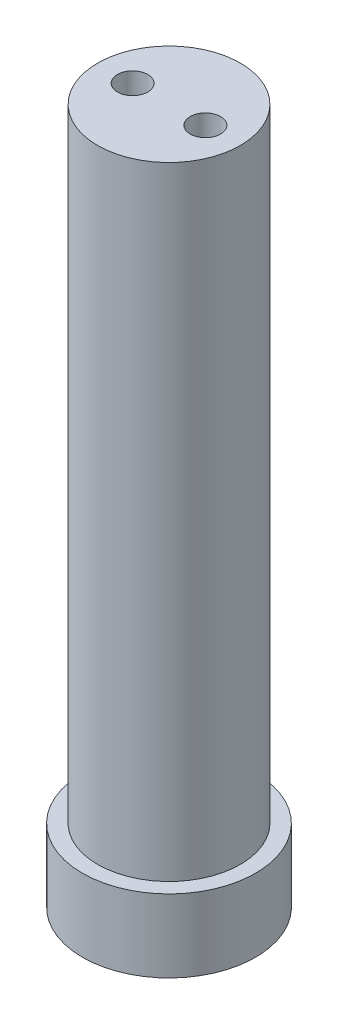
ISO-10303-21;
HEADER;
FILE_DESCRIPTION(('STEP AP214'),'2;1');
FILE_NAME('part.step','',(''),(''),'','','');
FILE_SCHEMA(('AUTOMOTIVE_DESIGN { 1 0 10303 214 1 1 1 1 }'));
ENDSEC;
DATA;
#1=APPLICATION_CONTEXT('core data for automotive mechanical design processes');
#2=APPLICATION_PROTOCOL_DEFINITION('international standard','automotive_design',2000,#1);
#3=PRODUCT_CONTEXT('',#1,'mechanical');
#4=PRODUCT('Part','Part','',(#3));
#5=PRODUCT_RELATED_PRODUCT_CATEGORY('part','',(#4));
#6=PRODUCT_DEFINITION_FORMATION('','',#4);
#7=PRODUCT_DEFINITION_CONTEXT('part definition',#1,'design');
#8=PRODUCT_DEFINITION('design','',#6,#7);
#9=PRODUCT_DEFINITION_SHAPE('','',#8);
#10=(LENGTH_UNIT() NAMED_UNIT(*) SI_UNIT(.MILLI.,.METRE.));
#11=(NAMED_UNIT(*) PLANE_ANGLE_UNIT() SI_UNIT($,.RADIAN.));
#12=(NAMED_UNIT(*) SI_UNIT($,.STERADIAN.) SOLID_ANGLE_UNIT());
#13=UNCERTAINTY_MEASURE_WITH_UNIT(LENGTH_MEASURE(1.E-05),#10,'distance_accuracy_value','');
#14=(GEOMETRIC_REPRESENTATION_CONTEXT(3) GLOBAL_UNCERTAINTY_ASSIGNED_CONTEXT((#13)) GLOBAL_UNIT_ASSIGNED_CONTEXT((#10,
#11,#12)) REPRESENTATION_CONTEXT('',''));
#15=CARTESIAN_POINT('',(0.,0.,0.));
#16=DIRECTION('',(0.,0.,1.));
#17=DIRECTION('',(1.,0.,0.));
#18=AXIS2_PLACEMENT_3D('',#15,#16,#17);
#19=CARTESIAN_POINT('',(0.,0.,0.));
#20=DIRECTION('',(0.,1.,0.));
#21=DIRECTION('',(0.,0.,1.));
#22=AXIS2_PLACEMENT_3D('',#19,#20,#21);
#23=PLANE('',#22);
#24=CARTESIAN_POINT('',(0.,0.,0.));
#25=DIRECTION('',(0.,1.,0.));
#26=DIRECTION('',(0.,0.,1.));
#27=AXIS2_PLACEMENT_3D('',#24,#25,#26);
#28=CIRCLE('',#27,1.51);
#29=CARTESIAN_POINT('',(0.,0.,1.51));
#30=VERTEX_POINT('',#29);
#31=EDGE_CURVE('E18',#30,#30,#28,.T.);
#32=ORIENTED_EDGE('',*,*,#31,.F.);
#33=EDGE_LOOP('',(#32));
#34=FACE_BOUND('',#33,.T.);
#35=CARTESIAN_POINT('',(0.635,0.,0.));
#36=DIRECTION('',(0.,1.,0.));
#37=DIRECTION('',(0.,0.,1.));
#38=AXIS2_PLACEMENT_3D('',#35,#36,#37);
#39=CIRCLE('',#38,0.265);
#40=CARTESIAN_POINT('',(0.635,0.,0.265));
#41=VERTEX_POINT('',#40);
#42=EDGE_CURVE('E38',#41,#41,#39,.T.);
#43=ORIENTED_EDGE('',*,*,#42,.T.);
#44=EDGE_LOOP('',(#43));
#45=FACE_BOUND('',#44,.T.);
#46=CARTESIAN_POINT('',(-0.635,0.,0.));
#47=DIRECTION('',(0.,1.,0.));
#48=DIRECTION('',(0.,0.,1.));
#49=AXIS2_PLACEMENT_3D('',#46,#47,#48);
#50=CIRCLE('',#49,0.265);
#51=CARTESIAN_POINT('',(-0.635,0.,0.265));
#52=VERTEX_POINT('',#51);
#53=EDGE_CURVE('E40',#52,#52,#50,.T.);
#54=ORIENTED_EDGE('',*,*,#53,.T.);
#55=EDGE_LOOP('',(#54));
#56=FACE_BOUND('',#55,.T.);
#57=ADVANCED_FACE('F15',(#34,#45,#56),#23,.F.);
#58=CARTESIAN_POINT('',(0.,3.69040339472804,0.));
#59=DIRECTION('',(0.,1.,0.));
#60=DIRECTION('',(0.,0.,1.));
#61=AXIS2_PLACEMENT_3D('',#58,#59,#60);
#62=CYLINDRICAL_SURFACE('',#61,1.51);
#63=CARTESIAN_POINT('',(0.,1.27,0.));
#64=DIRECTION('',(0.,1.,0.));
#65=DIRECTION('',(0.,0.,1.));
#66=AXIS2_PLACEMENT_3D('',#63,#64,#65);
#67=CIRCLE('',#66,1.51);
#68=CARTESIAN_POINT('',(0.,1.27,1.51));
#69=VERTEX_POINT('',#68);
#70=EDGE_CURVE('E35',#69,#69,#67,.F.);
#71=ORIENTED_EDGE('',*,*,#70,.T.);
#72=EDGE_LOOP('',(#71));
#73=FACE_BOUND('',#72,.T.);
#74=ORIENTED_EDGE('',*,*,#31,.T.);
#75=EDGE_LOOP('',(#74));
#76=FACE_BOUND('',#75,.T.);
#77=ADVANCED_FACE('F47',(#73,#76),#62,.T.);
#78=CARTESIAN_POINT('',(-0.635,0.,0.));
#79=DIRECTION('',(0.,1.,0.));
#80=DIRECTION('',(0.,0.,1.));
#81=AXIS2_PLACEMENT_3D('',#78,#79,#80);
#82=CYLINDRICAL_SURFACE('',#81,0.265);
#83=ORIENTED_EDGE('',*,*,#53,.F.);
#84=EDGE_LOOP('',(#83));
#85=FACE_BOUND('',#84,.T.);
#86=CARTESIAN_POINT('',(-0.635,12.13,0.));
#87=DIRECTION('',(0.,1.,0.));
#88=DIRECTION('',(0.,0.,1.));
#89=AXIS2_PLACEMENT_3D('',#86,#87,#88);
#90=CIRCLE('',#89,0.265);
#91=CARTESIAN_POINT('',(-0.635,12.13,0.265));
#92=VERTEX_POINT('',#91);
#93=EDGE_CURVE('E32',#92,#92,#90,.T.);
#94=ORIENTED_EDGE('',*,*,#93,.T.);
#95=EDGE_LOOP('',(#94));
#96=FACE_BOUND('',#95,.T.);
#97=ADVANCED_FACE('F57',(#85,#96),#82,.F.);
#98=CARTESIAN_POINT('',(0.635,0.,0.));
#99=DIRECTION('',(0.,1.,0.));
#100=DIRECTION('',(0.,0.,1.));
#101=AXIS2_PLACEMENT_3D('',#98,#99,#100);
#102=CYLINDRICAL_SURFACE('',#101,0.265);
#103=ORIENTED_EDGE('',*,*,#42,.F.);
#104=EDGE_LOOP('',(#103));
#105=FACE_BOUND('',#104,.T.);
#106=CARTESIAN_POINT('',(0.635,12.13,0.));
#107=DIRECTION('',(0.,1.,0.));
#108=DIRECTION('',(0.,0.,1.));
#109=AXIS2_PLACEMENT_3D('',#106,#107,#108);
#110=CIRCLE('',#109,0.265);
#111=CARTESIAN_POINT('',(0.635,12.13,0.265));
#112=VERTEX_POINT('',#111);
#113=EDGE_CURVE('E27',#112,#112,#110,.T.);
#114=ORIENTED_EDGE('',*,*,#113,.T.);
#115=EDGE_LOOP('',(#114));
#116=FACE_BOUND('',#115,.T.);
#117=ADVANCED_FACE('F53',(#105,#116),#102,.F.);
#118=CARTESIAN_POINT('',(1.51,1.27,0.));
#119=DIRECTION('',(0.,-1.,0.));
#120=DIRECTION('',(0.,0.,-1.));
#121=AXIS2_PLACEMENT_3D('',#118,#119,#120);
#122=PLANE('',#121);
#123=ORIENTED_EDGE('',*,*,#70,.F.);
#124=EDGE_LOOP('',(#123));
#125=FACE_BOUND('',#124,.T.);
#126=CARTESIAN_POINT('',(0.,1.27,0.));
#127=DIRECTION('',(0.,1.,0.));
#128=DIRECTION('',(0.,0.,1.));
#129=AXIS2_PLACEMENT_3D('',#126,#127,#128);
#130=CIRCLE('',#129,1.245);
#131=CARTESIAN_POINT('',(0.,1.27,1.245));
#132=VERTEX_POINT('',#131);
#133=EDGE_CURVE('E22',#132,#132,#130,.T.);
#134=ORIENTED_EDGE('',*,*,#133,.F.);
#135=EDGE_LOOP('',(#134));
#136=FACE_BOUND('',#135,.T.);
#137=ADVANCED_FACE('F56',(#125,#136),#122,.F.);
#138=CARTESIAN_POINT('',(1.245,12.13,0.));
#139=DIRECTION('',(0.,-1.,0.));
#140=DIRECTION('',(0.,0.,-1.));
#141=AXIS2_PLACEMENT_3D('',#138,#139,#140);
#142=PLANE('',#141);
#143=CARTESIAN_POINT('',(0.,12.13,0.));
#144=DIRECTION('',(0.,1.,0.));
#145=DIRECTION('',(0.,0.,1.));
#146=AXIS2_PLACEMENT_3D('',#143,#144,#145);
#147=CIRCLE('',#146,1.245);
#148=CARTESIAN_POINT('',(0.,12.13,1.245));
#149=VERTEX_POINT('',#148);
#150=EDGE_CURVE('E10',#149,#149,#147,.F.);
#151=ORIENTED_EDGE('',*,*,#150,.F.);
#152=EDGE_LOOP('',(#151));
#153=FACE_BOUND('',#152,.T.);
#154=ORIENTED_EDGE('',*,*,#113,.F.);
#155=EDGE_LOOP('',(#154));
#156=FACE_BOUND('',#155,.T.);
#157=ORIENTED_EDGE('',*,*,#93,.F.);
#158=EDGE_LOOP('',(#157));
#159=FACE_BOUND('',#158,.T.);
#160=ADVANCED_FACE('F61',(#153,#156,#159),#142,.F.);
#161=CARTESIAN_POINT('',(0.,3.69040339472804,0.));
#162=DIRECTION('',(0.,1.,0.));
#163=DIRECTION('',(0.,0.,1.));
#164=AXIS2_PLACEMENT_3D('',#161,#162,#163);
#165=CYLINDRICAL_SURFACE('',#164,1.245);
#166=ORIENTED_EDGE('',*,*,#150,.T.);
#167=EDGE_LOOP('',(#166));
#168=FACE_BOUND('',#167,.T.);
#169=ORIENTED_EDGE('',*,*,#133,.T.);
#170=EDGE_LOOP('',(#169));
#171=FACE_BOUND('',#170,.T.);
#172=ADVANCED_FACE('F64',(#168,#171),#165,.T.);
#173=CLOSED_SHELL('',(#57,#77,#97,#117,#137,#160,#172));
#174=MANIFOLD_SOLID_BREP('B1',#173);
#175=ADVANCED_BREP_SHAPE_REPRESENTATION('',(#18,#174),#14);
#176=SHAPE_DEFINITION_REPRESENTATION(#9,#175);
ENDSEC;
END-ISO-10303-21;
